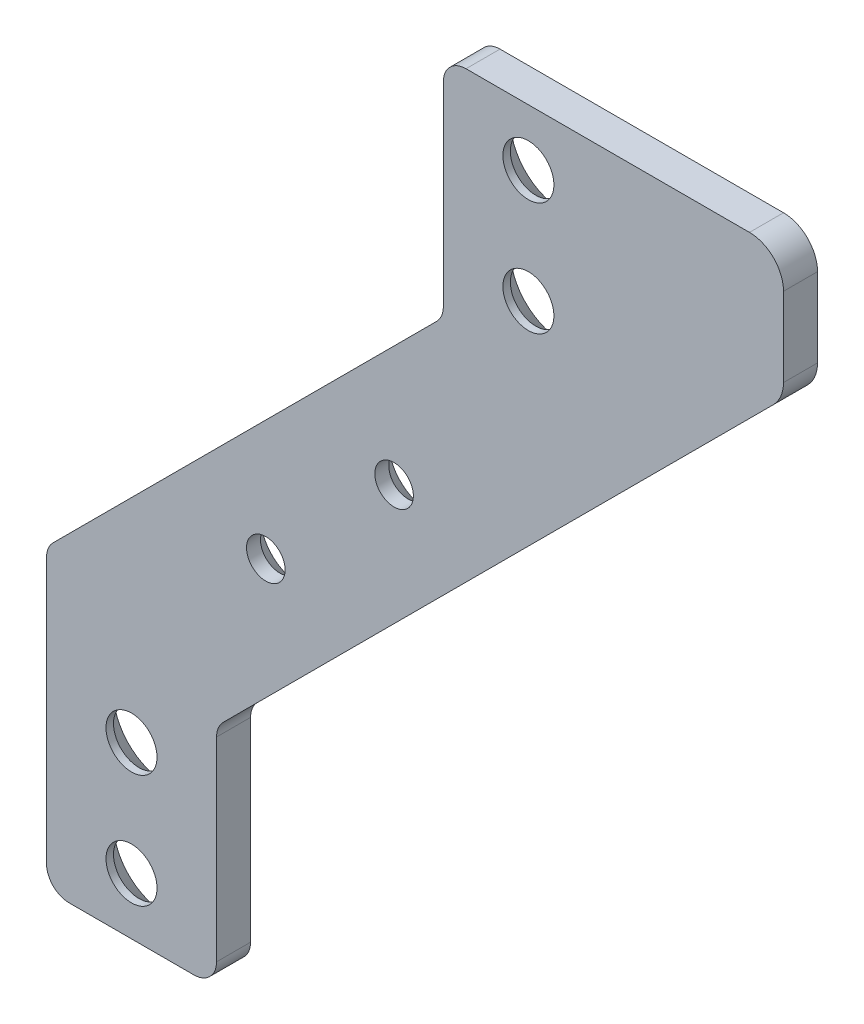
ISO-10303-21;
HEADER;
FILE_DESCRIPTION(('STEP AP214'),'2;1');
FILE_NAME('part.step','',(''),(''),'','','');
FILE_SCHEMA(('AUTOMOTIVE_DESIGN { 1 0 10303 214 1 1 1 1 }'));
ENDSEC;
DATA;
#1=APPLICATION_CONTEXT('core data for automotive mechanical design processes');
#2=APPLICATION_PROTOCOL_DEFINITION('international standard','automotive_design',2000,#1);
#3=PRODUCT_CONTEXT('',#1,'mechanical');
#4=PRODUCT('Part','Part','',(#3));
#5=PRODUCT_RELATED_PRODUCT_CATEGORY('part','',(#4));
#6=PRODUCT_DEFINITION_FORMATION('','',#4);
#7=PRODUCT_DEFINITION_CONTEXT('part definition',#1,'design');
#8=PRODUCT_DEFINITION('design','',#6,#7);
#9=PRODUCT_DEFINITION_SHAPE('','',#8);
#10=(LENGTH_UNIT() NAMED_UNIT(*) SI_UNIT(.MILLI.,.METRE.));
#11=(NAMED_UNIT(*) PLANE_ANGLE_UNIT() SI_UNIT($,.RADIAN.));
#12=(NAMED_UNIT(*) SI_UNIT($,.STERADIAN.) SOLID_ANGLE_UNIT());
#13=UNCERTAINTY_MEASURE_WITH_UNIT(LENGTH_MEASURE(1.E-05),#10,'distance_accuracy_value','');
#14=(GEOMETRIC_REPRESENTATION_CONTEXT(3) GLOBAL_UNCERTAINTY_ASSIGNED_CONTEXT((#13)) GLOBAL_UNIT_ASSIGNED_CONTEXT((#10,
#11,#12)) REPRESENTATION_CONTEXT('',''));
#15=CARTESIAN_POINT('',(0.,0.,0.));
#16=DIRECTION('',(0.,0.,1.));
#17=DIRECTION('',(1.,0.,0.));
#18=AXIS2_PLACEMENT_3D('',#15,#16,#17);
#19=CARTESIAN_POINT('',(0.,20.,3.));
#20=DIRECTION('',(-1.,0.,0.));
#21=DIRECTION('',(0.,-1.,0.));
#22=AXIS2_PLACEMENT_3D('',#19,#20,#21);
#23=PLANE('',#22);
#24=DIRECTION('',(0.,1.,0.));
#25=VECTOR('',#24,1.);
#26=CARTESIAN_POINT('',(0.,20.,3.));
#27=LINE('',#26,#25);
#28=CARTESIAN_POINT('',(0.,2.,3.));
#29=VERTEX_POINT('',#28);
#30=CARTESIAN_POINT('',(0.,19.1715728752538,3.));
#31=VERTEX_POINT('',#30);
#32=EDGE_CURVE('E170',#29,#31,#27,.T.);
#33=ORIENTED_EDGE('',*,*,#32,.F.);
#34=DIRECTION('',(0.,0.,-1.));
#35=VECTOR('',#34,1.);
#36=CARTESIAN_POINT('',(0.,2.,3.));
#37=LINE('',#36,#35);
#38=CARTESIAN_POINT('',(0.,2.,0.));
#39=VERTEX_POINT('',#38);
#40=EDGE_CURVE('E155',#29,#39,#37,.T.);
#41=ORIENTED_EDGE('',*,*,#40,.T.);
#42=DIRECTION('',(0.,1.,0.));
#43=VECTOR('',#42,1.);
#44=CARTESIAN_POINT('',(0.,20.,0.));
#45=LINE('',#44,#43);
#46=CARTESIAN_POINT('',(0.,19.1715728752538,0.));
#47=VERTEX_POINT('',#46);
#48=EDGE_CURVE('E167',#39,#47,#45,.T.);
#49=ORIENTED_EDGE('',*,*,#48,.T.);
#50=DIRECTION('',(0.,0.,-1.));
#51=VECTOR('',#50,1.);
#52=CARTESIAN_POINT('',(0.,19.1715728752538,3.));
#53=LINE('',#52,#51);
#54=EDGE_CURVE('E172',#47,#31,#53,.F.);
#55=ORIENTED_EDGE('',*,*,#54,.T.);
#56=EDGE_LOOP('',(#33,#41,#49,#55));
#57=FACE_BOUND('',#56,.T.);
#58=ADVANCED_FACE('F35',(#57),#23,.F.);
#59=CARTESIAN_POINT('',(35.,54.9999999999992,3.));
#60=DIRECTION('',(-0.70710678118654,0.707106781186555,0.));
#61=DIRECTION('',(-0.707106781186555,-0.70710678118654,0.));
#62=AXIS2_PLACEMENT_3D('',#59,#60,#61);
#63=PLANE('',#62);
#64=DIRECTION('',(0.707106781186555,0.70710678118654,0.));
#65=VECTOR('',#64,1.);
#66=CARTESIAN_POINT('',(35.,54.9999999999992,0.));
#67=LINE('',#66,#65);
#68=CARTESIAN_POINT('',(0.585786437626919,20.5857864376269,0.));
#69=VERTEX_POINT('',#68);
#70=CARTESIAN_POINT('',(49.1213203435596,69.1213203435585,0.));
#71=VERTEX_POINT('',#70);
#72=EDGE_CURVE('E179',#69,#71,#67,.T.);
#73=ORIENTED_EDGE('',*,*,#72,.T.);
#74=DIRECTION('',(0.,0.,-1.));
#75=VECTOR('',#74,1.);
#76=CARTESIAN_POINT('',(49.1213203435596,69.1213203435585,3.));
#77=LINE('',#76,#75);
#78=CARTESIAN_POINT('',(49.1213203435596,69.1213203435585,3.));
#79=VERTEX_POINT('',#78);
#80=EDGE_CURVE('E58',#71,#79,#77,.F.);
#81=ORIENTED_EDGE('',*,*,#80,.T.);
#82=DIRECTION('',(0.707106781186555,0.70710678118654,0.));
#83=VECTOR('',#82,1.);
#84=CARTESIAN_POINT('',(35.,54.9999999999992,3.));
#85=LINE('',#84,#83);
#86=CARTESIAN_POINT('',(0.585786437626919,20.5857864376269,3.));
#87=VERTEX_POINT('',#86);
#88=EDGE_CURVE('E287',#87,#79,#85,.T.);
#89=ORIENTED_EDGE('',*,*,#88,.F.);
#90=DIRECTION('',(0.,0.,-1.));
#91=VECTOR('',#90,1.);
#92=CARTESIAN_POINT('',(0.585786437626921,20.5857864376269,0.));
#93=LINE('',#92,#91);
#94=EDGE_CURVE('E238',#87,#69,#93,.T.);
#95=ORIENTED_EDGE('',*,*,#94,.T.);
#96=EDGE_LOOP('',(#73,#81,#89,#95));
#97=FACE_BOUND('',#96,.T.);
#98=ADVANCED_FACE('F298',(#97),#63,.F.);
#99=CARTESIAN_POINT('',(20.,81.2132034355957,3.));
#100=DIRECTION('',(0.,-1.,0.));
#101=DIRECTION('',(0.,0.,-1.));
#102=AXIS2_PLACEMENT_3D('',#99,#100,#101);
#103=PLANE('',#102);
#104=DIRECTION('',(-1.,0.,0.));
#105=VECTOR('',#104,1.);
#106=CARTESIAN_POINT('',(20.,81.2132034355957,3.));
#107=LINE('',#106,#105);
#108=CARTESIAN_POINT('',(47.,81.2132034355957,3.));
#109=VERTEX_POINT('',#108);
#110=CARTESIAN_POINT('',(22.,81.2132034355957,3.));
#111=VERTEX_POINT('',#110);
#112=EDGE_CURVE('E305',#109,#111,#107,.T.);
#113=ORIENTED_EDGE('',*,*,#112,.F.);
#114=DIRECTION('',(0.,0.,-1.));
#115=VECTOR('',#114,1.);
#116=CARTESIAN_POINT('',(47.,81.2132034355957,0.));
#117=LINE('',#116,#115);
#118=CARTESIAN_POINT('',(47.,81.2132034355957,0.));
#119=VERTEX_POINT('',#118);
#120=EDGE_CURVE('E11',#109,#119,#117,.T.);
#121=ORIENTED_EDGE('',*,*,#120,.T.);
#122=DIRECTION('',(-1.,0.,0.));
#123=VECTOR('',#122,1.);
#124=CARTESIAN_POINT('',(20.,81.2132034355957,0.));
#125=LINE('',#124,#123);
#126=CARTESIAN_POINT('',(22.,81.2132034355957,0.));
#127=VERTEX_POINT('',#126);
#128=EDGE_CURVE('E182',#119,#127,#125,.T.);
#129=ORIENTED_EDGE('',*,*,#128,.T.);
#130=DIRECTION('',(0.,0.,-1.));
#131=VECTOR('',#130,1.);
#132=CARTESIAN_POINT('',(22.,81.2132034355957,3.));
#133=LINE('',#132,#131);
#134=EDGE_CURVE('E235',#127,#111,#133,.F.);
#135=ORIENTED_EDGE('',*,*,#134,.T.);
#136=EDGE_LOOP('',(#113,#121,#129,#135));
#137=FACE_BOUND('',#136,.T.);
#138=ADVANCED_FACE('F355',(#137),#103,.F.);
#139=CARTESIAN_POINT('',(20.,61.2132034355957,3.));
#140=DIRECTION('',(1.,0.,0.));
#141=DIRECTION('',(0.,0.,-1.));
#142=AXIS2_PLACEMENT_3D('',#139,#140,#141);
#143=PLANE('',#142);
#144=DIRECTION('',(0.,-1.,0.));
#145=VECTOR('',#144,1.);
#146=CARTESIAN_POINT('',(20.,61.2132034355957,0.));
#147=LINE('',#146,#145);
#148=CARTESIAN_POINT('',(20.,79.2132034355957,0.));
#149=VERTEX_POINT('',#148);
#150=CARTESIAN_POINT('',(20.,62.0416305603419,0.));
#151=VERTEX_POINT('',#150);
#152=EDGE_CURVE('E192',#149,#151,#147,.T.);
#153=ORIENTED_EDGE('',*,*,#152,.T.);
#154=DIRECTION('',(0.,0.,-1.));
#155=VECTOR('',#154,1.);
#156=CARTESIAN_POINT('',(20.,62.0416305603419,3.));
#157=LINE('',#156,#155);
#158=CARTESIAN_POINT('',(20.,62.0416305603419,3.));
#159=VERTEX_POINT('',#158);
#160=EDGE_CURVE('E233',#151,#159,#157,.F.);
#161=ORIENTED_EDGE('',*,*,#160,.T.);
#162=DIRECTION('',(0.,-1.,0.));
#163=VECTOR('',#162,1.);
#164=CARTESIAN_POINT('',(20.,61.2132034355957,3.));
#165=LINE('',#164,#163);
#166=CARTESIAN_POINT('',(20.,79.2132034355957,3.));
#167=VERTEX_POINT('',#166);
#168=EDGE_CURVE('E311',#167,#159,#165,.T.);
#169=ORIENTED_EDGE('',*,*,#168,.F.);
#170=DIRECTION('',(0.,0.,-1.));
#171=VECTOR('',#170,1.);
#172=CARTESIAN_POINT('',(20.,79.2132034355957,3.));
#173=LINE('',#172,#171);
#174=EDGE_CURVE('E230',#167,#149,#173,.T.);
#175=ORIENTED_EDGE('',*,*,#174,.T.);
#176=EDGE_LOOP('',(#153,#161,#169,#175));
#177=FACE_BOUND('',#176,.T.);
#178=ADVANCED_FACE('F346',(#177),#143,.F.);
#179=CARTESIAN_POINT('',(-15.,26.2132034355958,3.));
#180=DIRECTION('',(0.707106781186546,-0.707106781186549,0.));
#181=DIRECTION('',(0.707106781186549,0.707106781186546,0.));
#182=AXIS2_PLACEMENT_3D('',#179,#180,#181);
#183=PLANE('',#182);
#184=DIRECTION('',(-0.707106781186549,-0.707106781186546,0.));
#185=VECTOR('',#184,1.);
#186=CARTESIAN_POINT('',(-15.,26.2132034355958,0.));
#187=LINE('',#186,#185);
#188=CARTESIAN_POINT('',(19.4142135623731,60.6274169979688,0.));
#189=VERTEX_POINT('',#188);
#190=CARTESIAN_POINT('',(-14.4142135623731,26.7989898732227,0.));
#191=VERTEX_POINT('',#190);
#192=EDGE_CURVE('E195',#189,#191,#187,.T.);
#193=ORIENTED_EDGE('',*,*,#192,.T.);
#194=DIRECTION('',(0.,0.,-1.));
#195=VECTOR('',#194,1.);
#196=CARTESIAN_POINT('',(-14.4142135623731,26.7989898732227,3.));
#197=LINE('',#196,#195);
#198=CARTESIAN_POINT('',(-14.4142135623731,26.7989898732227,3.));
#199=VERTEX_POINT('',#198);
#200=EDGE_CURVE('E228',#191,#199,#197,.F.);
#201=ORIENTED_EDGE('',*,*,#200,.T.);
#202=DIRECTION('',(-0.707106781186549,-0.707106781186546,0.));
#203=VECTOR('',#202,1.);
#204=CARTESIAN_POINT('',(-15.,26.2132034355958,3.));
#205=LINE('',#204,#203);
#206=CARTESIAN_POINT('',(19.4142135623731,60.6274169979688,3.));
#207=VERTEX_POINT('',#206);
#208=EDGE_CURVE('E314',#207,#199,#205,.T.);
#209=ORIENTED_EDGE('',*,*,#208,.F.);
#210=DIRECTION('',(0.,0.,-1.));
#211=VECTOR('',#210,1.);
#212=CARTESIAN_POINT('',(19.4142135623731,60.6274169979688,0.));
#213=LINE('',#212,#211);
#214=EDGE_CURVE('E225',#207,#189,#213,.T.);
#215=ORIENTED_EDGE('',*,*,#214,.T.);
#216=EDGE_LOOP('',(#193,#201,#209,#215));
#217=FACE_BOUND('',#216,.T.);
#218=ADVANCED_FACE('F337',(#217),#183,.F.);
#219=CARTESIAN_POINT('',(-15.,0.,3.));
#220=DIRECTION('',(1.,0.,0.));
#221=DIRECTION('',(0.,0.,-1.));
#222=AXIS2_PLACEMENT_3D('',#219,#220,#221);
#223=PLANE('',#222);
#224=DIRECTION('',(0.,-1.,0.));
#225=VECTOR('',#224,1.);
#226=CARTESIAN_POINT('',(-15.,0.,0.));
#227=LINE('',#226,#225);
#228=CARTESIAN_POINT('',(-15.,25.3847763108496,0.));
#229=VERTEX_POINT('',#228);
#230=CARTESIAN_POINT('',(-15.,2.,0.));
#231=VERTEX_POINT('',#230);
#232=EDGE_CURVE('E198',#229,#231,#227,.T.);
#233=ORIENTED_EDGE('',*,*,#232,.T.);
#234=DIRECTION('',(0.,0.,-1.));
#235=VECTOR('',#234,1.);
#236=CARTESIAN_POINT('',(-15.,2.,3.));
#237=LINE('',#236,#235);
#238=CARTESIAN_POINT('',(-15.,2.,3.));
#239=VERTEX_POINT('',#238);
#240=EDGE_CURVE('E223',#231,#239,#237,.F.);
#241=ORIENTED_EDGE('',*,*,#240,.T.);
#242=DIRECTION('',(0.,-1.,0.));
#243=VECTOR('',#242,1.);
#244=CARTESIAN_POINT('',(-15.,0.,3.));
#245=LINE('',#244,#243);
#246=CARTESIAN_POINT('',(-15.,25.3847763108496,3.));
#247=VERTEX_POINT('',#246);
#248=EDGE_CURVE('E316',#247,#239,#245,.T.);
#249=ORIENTED_EDGE('',*,*,#248,.F.);
#250=DIRECTION('',(0.,0.,-1.));
#251=VECTOR('',#250,1.);
#252=CARTESIAN_POINT('',(-15.,25.3847763108496,3.));
#253=LINE('',#252,#251);
#254=EDGE_CURVE('E220',#247,#229,#253,.T.);
#255=ORIENTED_EDGE('',*,*,#254,.T.);
#256=EDGE_LOOP('',(#233,#241,#249,#255));
#257=FACE_BOUND('',#256,.T.);
#258=ADVANCED_FACE('F329',(#257),#223,.F.);
#259=CARTESIAN_POINT('',(0.,0.,3.));
#260=DIRECTION('',(0.,1.,0.));
#261=DIRECTION('',(0.,0.,1.));
#262=AXIS2_PLACEMENT_3D('',#259,#260,#261);
#263=PLANE('',#262);
#264=DIRECTION('',(1.,0.,0.));
#265=VECTOR('',#264,1.);
#266=CARTESIAN_POINT('',(0.,0.,0.));
#267=LINE('',#266,#265);
#268=CARTESIAN_POINT('',(-13.,0.,0.));
#269=VERTEX_POINT('',#268);
#270=CARTESIAN_POINT('',(-2.,0.,0.));
#271=VERTEX_POINT('',#270);
#272=EDGE_CURVE('E201',#269,#271,#267,.T.);
#273=ORIENTED_EDGE('',*,*,#272,.T.);
#274=DIRECTION('',(0.,0.,-1.));
#275=VECTOR('',#274,1.);
#276=CARTESIAN_POINT('',(-2.,0.,3.));
#277=LINE('',#276,#275);
#278=CARTESIAN_POINT('',(-2.,0.,3.));
#279=VERTEX_POINT('',#278);
#280=EDGE_CURVE('E156',#271,#279,#277,.F.);
#281=ORIENTED_EDGE('',*,*,#280,.T.);
#282=DIRECTION('',(1.,0.,0.));
#283=VECTOR('',#282,1.);
#284=CARTESIAN_POINT('',(0.,0.,3.));
#285=LINE('',#284,#283);
#286=CARTESIAN_POINT('',(-13.,0.,3.));
#287=VERTEX_POINT('',#286);
#288=EDGE_CURVE('E188',#287,#279,#285,.T.);
#289=ORIENTED_EDGE('',*,*,#288,.F.);
#290=DIRECTION('',(0.,0.,-1.));
#291=VECTOR('',#290,1.);
#292=CARTESIAN_POINT('',(-13.,0.,3.));
#293=LINE('',#292,#291);
#294=EDGE_CURVE('E161',#287,#269,#293,.T.);
#295=ORIENTED_EDGE('',*,*,#294,.T.);
#296=EDGE_LOOP('',(#273,#281,#289,#295));
#297=FACE_BOUND('',#296,.T.);
#298=ADVANCED_FACE('F323',(#297),#263,.F.);
#299=CARTESIAN_POINT('',(0.,0.,3.));
#300=DIRECTION('',(0.,0.,-1.));
#301=DIRECTION('',(-1.,0.,0.));
#302=AXIS2_PLACEMENT_3D('',#299,#300,#301);
#303=PLANE('',#302);
#304=CARTESIAN_POINT('',(15.6568542494924,46.2634559672906,3.));
#305=DIRECTION('',(0.,0.,-1.));
#306=DIRECTION('',(-1.,0.,0.));
#307=AXIS2_PLACEMENT_3D('',#304,#305,#306);
#308=CIRCLE('',#307,1.69999999999999);
#309=CARTESIAN_POINT('',(13.9568542494924,46.2634559672906,3.));
#310=VERTEX_POINT('',#309);
#311=EDGE_CURVE('E269',#310,#310,#308,.T.);
#312=ORIENTED_EDGE('',*,*,#311,.T.);
#313=EDGE_LOOP('',(#312));
#314=FACE_BOUND('',#313,.T.);
#315=CARTESIAN_POINT('',(4.34314575050764,34.9497474683058,3.));
#316=DIRECTION('',(0.,0.,-1.));
#317=DIRECTION('',(-1.,0.,0.));
#318=AXIS2_PLACEMENT_3D('',#315,#316,#317);
#319=CIRCLE('',#318,1.69999999999999);
#320=CARTESIAN_POINT('',(2.64314575050765,34.9497474683058,3.));
#321=VERTEX_POINT('',#320);
#322=EDGE_CURVE('E264',#321,#321,#319,.T.);
#323=ORIENTED_EDGE('',*,*,#322,.T.);
#324=EDGE_LOOP('',(#323));
#325=FACE_BOUND('',#324,.T.);
#326=CARTESIAN_POINT('',(27.5,76.2132034355963,3.));
#327=DIRECTION('',(0.,0.,-1.));
#328=DIRECTION('',(-1.,0.,0.));
#329=AXIS2_PLACEMENT_3D('',#326,#327,#328);
#330=CIRCLE('',#329,2.24999999999999);
#331=CARTESIAN_POINT('',(25.25,76.2132034355963,3.));
#332=VERTEX_POINT('',#331);
#333=EDGE_CURVE('E259',#332,#332,#330,.T.);
#334=ORIENTED_EDGE('',*,*,#333,.T.);
#335=EDGE_LOOP('',(#334));
#336=FACE_BOUND('',#335,.T.);
#337=CARTESIAN_POINT('',(27.5,66.2132034355963,3.));
#338=DIRECTION('',(0.,0.,-1.));
#339=DIRECTION('',(-1.,0.,0.));
#340=AXIS2_PLACEMENT_3D('',#337,#338,#339);
#341=CIRCLE('',#340,2.24999999999999);
#342=CARTESIAN_POINT('',(25.25,66.2132034355963,3.));
#343=VERTEX_POINT('',#342);
#344=EDGE_CURVE('E254',#343,#343,#341,.T.);
#345=ORIENTED_EDGE('',*,*,#344,.T.);
#346=EDGE_LOOP('',(#345));
#347=FACE_BOUND('',#346,.T.);
#348=CARTESIAN_POINT('',(-7.5,15.,3.));
#349=DIRECTION('',(0.,0.,-1.));
#350=DIRECTION('',(-1.,0.,0.));
#351=AXIS2_PLACEMENT_3D('',#348,#349,#350);
#352=CIRCLE('',#351,2.24999999999999);
#353=CARTESIAN_POINT('',(-9.74999999999999,15.,3.));
#354=VERTEX_POINT('',#353);
#355=EDGE_CURVE('E249',#354,#354,#352,.T.);
#356=ORIENTED_EDGE('',*,*,#355,.T.);
#357=EDGE_LOOP('',(#356));
#358=FACE_BOUND('',#357,.T.);
#359=CARTESIAN_POINT('',(-7.5,5.,3.));
#360=DIRECTION('',(0.,0.,-1.));
#361=DIRECTION('',(-1.,0.,0.));
#362=AXIS2_PLACEMENT_3D('',#359,#360,#361);
#363=CIRCLE('',#362,2.24999999999999);
#364=CARTESIAN_POINT('',(-9.74999999999999,5.,3.));
#365=VERTEX_POINT('',#364);
#366=EDGE_CURVE('E180',#365,#365,#363,.T.);
#367=ORIENTED_EDGE('',*,*,#366,.T.);
#368=EDGE_LOOP('',(#367));
#369=FACE_BOUND('',#368,.T.);
#370=ORIENTED_EDGE('',*,*,#88,.T.);
#371=CARTESIAN_POINT('',(47.,71.2426406871182,3.));
#372=DIRECTION('',(0.,0.,-1.));
#373=DIRECTION('',(-1.,0.,0.));
#374=AXIS2_PLACEMENT_3D('',#371,#372,#373);
#375=CIRCLE('',#374,3.);
#376=CARTESIAN_POINT('',(50.,71.2426406871182,3.));
#377=VERTEX_POINT('',#376);
#378=EDGE_CURVE('E43',#79,#377,#375,.F.);
#379=ORIENTED_EDGE('',*,*,#378,.T.);
#380=DIRECTION('',(0.,1.,0.));
#381=VECTOR('',#380,1.);
#382=CARTESIAN_POINT('',(50.,81.2132034355963,3.));
#383=LINE('',#382,#381);
#384=CARTESIAN_POINT('',(50.,78.2132034355957,3.));
#385=VERTEX_POINT('',#384);
#386=EDGE_CURVE('E286',#377,#385,#383,.T.);
#387=ORIENTED_EDGE('',*,*,#386,.T.);
#388=CARTESIAN_POINT('',(47.,78.2132034355957,3.));
#389=DIRECTION('',(0.,0.,-1.));
#390=DIRECTION('',(-1.,0.,0.));
#391=AXIS2_PLACEMENT_3D('',#388,#389,#390);
#392=CIRCLE('',#391,3.);
#393=EDGE_CURVE('E50',#385,#109,#392,.F.);
#394=ORIENTED_EDGE('',*,*,#393,.T.);
#395=ORIENTED_EDGE('',*,*,#112,.T.);
#396=CARTESIAN_POINT('',(22.,79.2132034355957,3.));
#397=DIRECTION('',(0.,0.,-1.));
#398=DIRECTION('',(-1.,0.,0.));
#399=AXIS2_PLACEMENT_3D('',#396,#397,#398);
#400=CIRCLE('',#399,2.);
#401=EDGE_CURVE('E212',#111,#167,#400,.F.);
#402=ORIENTED_EDGE('',*,*,#401,.T.);
#403=ORIENTED_EDGE('',*,*,#168,.T.);
#404=CARTESIAN_POINT('',(18.,62.0416305603419,3.));
#405=DIRECTION('',(0.,0.,-1.));
#406=DIRECTION('',(-1.,0.,0.));
#407=AXIS2_PLACEMENT_3D('',#404,#405,#406);
#408=CIRCLE('',#407,2.);
#409=EDGE_CURVE('E243',#159,#207,#408,.T.);
#410=ORIENTED_EDGE('',*,*,#409,.T.);
#411=ORIENTED_EDGE('',*,*,#208,.T.);
#412=CARTESIAN_POINT('',(-13.,25.3847763108496,3.));
#413=DIRECTION('',(0.,0.,-1.));
#414=DIRECTION('',(-1.,0.,0.));
#415=AXIS2_PLACEMENT_3D('',#412,#413,#414);
#416=CIRCLE('',#415,2.);
#417=EDGE_CURVE('E214',#199,#247,#416,.F.);
#418=ORIENTED_EDGE('',*,*,#417,.T.);
#419=ORIENTED_EDGE('',*,*,#248,.T.);
#420=CARTESIAN_POINT('',(-13.,2.,3.));
#421=DIRECTION('',(0.,0.,-1.));
#422=DIRECTION('',(-1.,0.,0.));
#423=AXIS2_PLACEMENT_3D('',#420,#421,#422);
#424=CIRCLE('',#423,2.);
#425=EDGE_CURVE('E216',#239,#287,#424,.F.);
#426=ORIENTED_EDGE('',*,*,#425,.T.);
#427=ORIENTED_EDGE('',*,*,#288,.T.);
#428=CARTESIAN_POINT('',(-2.,2.,3.));
#429=DIRECTION('',(0.,0.,-1.));
#430=DIRECTION('',(-1.,0.,0.));
#431=AXIS2_PLACEMENT_3D('',#428,#429,#430);
#432=CIRCLE('',#431,2.);
#433=EDGE_CURVE('E218',#279,#29,#432,.F.);
#434=ORIENTED_EDGE('',*,*,#433,.T.);
#435=ORIENTED_EDGE('',*,*,#32,.T.);
#436=CARTESIAN_POINT('',(2.,19.1715728752538,3.));
#437=DIRECTION('',(0.,0.,-1.));
#438=DIRECTION('',(-1.,0.,0.));
#439=AXIS2_PLACEMENT_3D('',#436,#437,#438);
#440=CIRCLE('',#439,2.);
#441=EDGE_CURVE('E246',#31,#87,#440,.T.);
#442=ORIENTED_EDGE('',*,*,#441,.T.);
#443=EDGE_LOOP('',(#370,#379,#387,#394,#395,#402,#403,#410,#411,#418,#419,#426,#427,#434,#435,#442));
#444=FACE_BOUND('',#443,.T.);
#445=ADVANCED_FACE('F285',(#314,#325,#336,#347,#358,#369,#444),#303,.F.);
#446=CARTESIAN_POINT('',(0.,0.,0.));
#447=DIRECTION('',(0.,0.,-1.));
#448=DIRECTION('',(-1.,0.,0.));
#449=AXIS2_PLACEMENT_3D('',#446,#447,#448);
#450=PLANE('',#449);
#451=DIRECTION('',(0.,-1.,0.));
#452=VECTOR('',#451,1.);
#453=CARTESIAN_POINT('',(50.,81.2132034355963,0.));
#454=LINE('',#453,#452);
#455=CARTESIAN_POINT('',(50.,78.2132034355957,0.));
#456=VERTEX_POINT('',#455);
#457=CARTESIAN_POINT('',(50.,71.2426406871182,0.));
#458=VERTEX_POINT('',#457);
#459=EDGE_CURVE('E295',#456,#458,#454,.T.);
#460=ORIENTED_EDGE('',*,*,#459,.T.);
#461=CARTESIAN_POINT('',(47.,71.2426406871182,0.));
#462=DIRECTION('',(0.,0.,-1.));
#463=DIRECTION('',(-1.,0.,0.));
#464=AXIS2_PLACEMENT_3D('',#461,#462,#463);
#465=CIRCLE('',#464,3.);
#466=EDGE_CURVE('E280',#458,#71,#465,.T.);
#467=ORIENTED_EDGE('',*,*,#466,.T.);
#468=ORIENTED_EDGE('',*,*,#72,.F.);
#469=CARTESIAN_POINT('',(2.,19.1715728752538,0.));
#470=DIRECTION('',(0.,0.,-1.));
#471=DIRECTION('',(-1.,0.,0.));
#472=AXIS2_PLACEMENT_3D('',#469,#470,#471);
#473=CIRCLE('',#472,2.);
#474=EDGE_CURVE('E178',#69,#47,#473,.F.);
#475=ORIENTED_EDGE('',*,*,#474,.T.);
#476=ORIENTED_EDGE('',*,*,#48,.F.);
#477=CARTESIAN_POINT('',(-2.,2.,0.));
#478=DIRECTION('',(0.,0.,-1.));
#479=DIRECTION('',(-1.,0.,0.));
#480=AXIS2_PLACEMENT_3D('',#477,#478,#479);
#481=CIRCLE('',#480,2.);
#482=EDGE_CURVE('E151',#39,#271,#481,.T.);
#483=ORIENTED_EDGE('',*,*,#482,.T.);
#484=ORIENTED_EDGE('',*,*,#272,.F.);
#485=CARTESIAN_POINT('',(-13.,2.,0.));
#486=DIRECTION('',(0.,0.,-1.));
#487=DIRECTION('',(-1.,0.,0.));
#488=AXIS2_PLACEMENT_3D('',#485,#486,#487);
#489=CIRCLE('',#488,2.);
#490=EDGE_CURVE('E162',#269,#231,#489,.T.);
#491=ORIENTED_EDGE('',*,*,#490,.T.);
#492=ORIENTED_EDGE('',*,*,#232,.F.);
#493=CARTESIAN_POINT('',(-13.,25.3847763108496,0.));
#494=DIRECTION('',(0.,0.,-1.));
#495=DIRECTION('',(-1.,0.,0.));
#496=AXIS2_PLACEMENT_3D('',#493,#494,#495);
#497=CIRCLE('',#496,2.);
#498=EDGE_CURVE('E206',#229,#191,#497,.T.);
#499=ORIENTED_EDGE('',*,*,#498,.T.);
#500=ORIENTED_EDGE('',*,*,#192,.F.);
#501=CARTESIAN_POINT('',(18.,62.0416305603419,0.));
#502=DIRECTION('',(0.,0.,-1.));
#503=DIRECTION('',(-1.,0.,0.));
#504=AXIS2_PLACEMENT_3D('',#501,#502,#503);
#505=CIRCLE('',#504,2.);
#506=EDGE_CURVE('E241',#189,#151,#505,.F.);
#507=ORIENTED_EDGE('',*,*,#506,.T.);
#508=ORIENTED_EDGE('',*,*,#152,.F.);
#509=CARTESIAN_POINT('',(22.,79.2132034355957,0.));
#510=DIRECTION('',(0.,0.,-1.));
#511=DIRECTION('',(-1.,0.,0.));
#512=AXIS2_PLACEMENT_3D('',#509,#510,#511);
#513=CIRCLE('',#512,2.);
#514=EDGE_CURVE('E171',#149,#127,#513,.T.);
#515=ORIENTED_EDGE('',*,*,#514,.T.);
#516=ORIENTED_EDGE('',*,*,#128,.F.);
#517=CARTESIAN_POINT('',(47.,78.2132034355957,0.));
#518=DIRECTION('',(0.,0.,-1.));
#519=DIRECTION('',(-1.,0.,0.));
#520=AXIS2_PLACEMENT_3D('',#517,#518,#519);
#521=CIRCLE('',#520,3.);
#522=EDGE_CURVE('E278',#119,#456,#521,.T.);
#523=ORIENTED_EDGE('',*,*,#522,.T.);
#524=EDGE_LOOP('',(#460,#467,#468,#475,#476,#483,#484,#491,#492,#499,#500,#507,#508,#515,#516,#523));
#525=FACE_BOUND('',#524,.T.);
#526=CARTESIAN_POINT('',(15.6568542494924,46.2634559672906,0.));
#527=DIRECTION('',(0.,0.,-1.));
#528=DIRECTION('',(-1.,0.,0.));
#529=AXIS2_PLACEMENT_3D('',#526,#527,#528);
#530=CIRCLE('',#529,3.47);
#531=CARTESIAN_POINT('',(12.1868542494924,46.2634559672906,0.));
#532=VERTEX_POINT('',#531);
#533=EDGE_CURVE('E294',#532,#532,#530,.T.);
#534=ORIENTED_EDGE('',*,*,#533,.F.);
#535=EDGE_LOOP('',(#534));
#536=FACE_BOUND('',#535,.T.);
#537=CARTESIAN_POINT('',(4.34314575050764,34.9497474683058,0.));
#538=DIRECTION('',(0.,0.,-1.));
#539=DIRECTION('',(-1.,0.,0.));
#540=AXIS2_PLACEMENT_3D('',#537,#538,#539);
#541=CIRCLE('',#540,3.47);
#542=CARTESIAN_POINT('',(0.873145750507637,34.9497474683058,0.));
#543=VERTEX_POINT('',#542);
#544=EDGE_CURVE('E272',#543,#543,#541,.T.);
#545=ORIENTED_EDGE('',*,*,#544,.F.);
#546=EDGE_LOOP('',(#545));
#547=FACE_BOUND('',#546,.T.);
#548=CARTESIAN_POINT('',(27.5,76.2132034355963,0.));
#549=DIRECTION('',(0.,0.,-1.));
#550=DIRECTION('',(-1.,0.,0.));
#551=AXIS2_PLACEMENT_3D('',#548,#549,#550);
#552=CIRCLE('',#551,4.59);
#553=CARTESIAN_POINT('',(22.91,76.2132034355963,0.));
#554=VERTEX_POINT('',#553);
#555=EDGE_CURVE('E267',#554,#554,#552,.T.);
#556=ORIENTED_EDGE('',*,*,#555,.F.);
#557=EDGE_LOOP('',(#556));
#558=FACE_BOUND('',#557,.T.);
#559=CARTESIAN_POINT('',(27.5,66.2132034355963,0.));
#560=DIRECTION('',(0.,0.,-1.));
#561=DIRECTION('',(-1.,0.,0.));
#562=AXIS2_PLACEMENT_3D('',#559,#560,#561);
#563=CIRCLE('',#562,4.59);
#564=CARTESIAN_POINT('',(22.91,66.2132034355963,0.));
#565=VERTEX_POINT('',#564);
#566=EDGE_CURVE('E262',#565,#565,#563,.T.);
#567=ORIENTED_EDGE('',*,*,#566,.F.);
#568=EDGE_LOOP('',(#567));
#569=FACE_BOUND('',#568,.T.);
#570=CARTESIAN_POINT('',(-7.5,15.,0.));
#571=DIRECTION('',(0.,0.,-1.));
#572=DIRECTION('',(-1.,0.,0.));
#573=AXIS2_PLACEMENT_3D('',#570,#571,#572);
#574=CIRCLE('',#573,4.59);
#575=CARTESIAN_POINT('',(-12.09,15.,0.));
#576=VERTEX_POINT('',#575);
#577=EDGE_CURVE('E257',#576,#576,#574,.T.);
#578=ORIENTED_EDGE('',*,*,#577,.F.);
#579=EDGE_LOOP('',(#578));
#580=FACE_BOUND('',#579,.T.);
#581=CARTESIAN_POINT('',(-7.5,5.,0.));
#582=DIRECTION('',(0.,0.,-1.));
#583=DIRECTION('',(-1.,0.,0.));
#584=AXIS2_PLACEMENT_3D('',#581,#582,#583);
#585=CIRCLE('',#584,4.59);
#586=CARTESIAN_POINT('',(-12.09,5.,0.));
#587=VERTEX_POINT('',#586);
#588=EDGE_CURVE('E252',#587,#587,#585,.T.);
#589=ORIENTED_EDGE('',*,*,#588,.F.);
#590=EDGE_LOOP('',(#589));
#591=FACE_BOUND('',#590,.T.);
#592=ADVANCED_FACE('F175',(#525,#536,#547,#558,#569,#580,#591),#450,.T.);
#593=CARTESIAN_POINT('',(-2.,2.,3.));
#594=DIRECTION('',(0.,0.,-1.));
#595=DIRECTION('',(-1.,0.,0.));
#596=AXIS2_PLACEMENT_3D('',#593,#594,#595);
#597=CYLINDRICAL_SURFACE('',#596,2.);
#598=ORIENTED_EDGE('',*,*,#433,.F.);
#599=ORIENTED_EDGE('',*,*,#280,.F.);
#600=ORIENTED_EDGE('',*,*,#482,.F.);
#601=ORIENTED_EDGE('',*,*,#40,.F.);
#602=EDGE_LOOP('',(#598,#599,#600,#601));
#603=FACE_BOUND('',#602,.T.);
#604=ADVANCED_FACE('F154',(#603),#597,.T.);
#605=CARTESIAN_POINT('',(-13.,2.,3.));
#606=DIRECTION('',(0.,0.,-1.));
#607=DIRECTION('',(-1.,0.,0.));
#608=AXIS2_PLACEMENT_3D('',#605,#606,#607);
#609=CYLINDRICAL_SURFACE('',#608,2.);
#610=ORIENTED_EDGE('',*,*,#425,.F.);
#611=ORIENTED_EDGE('',*,*,#240,.F.);
#612=ORIENTED_EDGE('',*,*,#490,.F.);
#613=ORIENTED_EDGE('',*,*,#294,.F.);
#614=EDGE_LOOP('',(#610,#611,#612,#613));
#615=FACE_BOUND('',#614,.T.);
#616=ADVANCED_FACE('F325',(#615),#609,.T.);
#617=CARTESIAN_POINT('',(-13.,25.3847763108496,3.));
#618=DIRECTION('',(0.,0.,-1.));
#619=DIRECTION('',(-1.,0.,0.));
#620=AXIS2_PLACEMENT_3D('',#617,#618,#619);
#621=CYLINDRICAL_SURFACE('',#620,2.);
#622=ORIENTED_EDGE('',*,*,#417,.F.);
#623=ORIENTED_EDGE('',*,*,#200,.F.);
#624=ORIENTED_EDGE('',*,*,#498,.F.);
#625=ORIENTED_EDGE('',*,*,#254,.F.);
#626=EDGE_LOOP('',(#622,#623,#624,#625));
#627=FACE_BOUND('',#626,.T.);
#628=ADVANCED_FACE('F333',(#627),#621,.T.);
#629=CARTESIAN_POINT('',(18.,62.0416305603419,3.));
#630=DIRECTION('',(0.,0.,1.));
#631=DIRECTION('',(1.,0.,0.));
#632=AXIS2_PLACEMENT_3D('',#629,#630,#631);
#633=CYLINDRICAL_SURFACE('',#632,2.);
#634=ORIENTED_EDGE('',*,*,#409,.F.);
#635=ORIENTED_EDGE('',*,*,#160,.F.);
#636=ORIENTED_EDGE('',*,*,#506,.F.);
#637=ORIENTED_EDGE('',*,*,#214,.F.);
#638=EDGE_LOOP('',(#634,#635,#636,#637));
#639=FACE_BOUND('',#638,.T.);
#640=ADVANCED_FACE('F342',(#639),#633,.F.);
#641=CARTESIAN_POINT('',(22.,79.2132034355957,3.));
#642=DIRECTION('',(0.,0.,-1.));
#643=DIRECTION('',(-1.,0.,0.));
#644=AXIS2_PLACEMENT_3D('',#641,#642,#643);
#645=CYLINDRICAL_SURFACE('',#644,2.);
#646=ORIENTED_EDGE('',*,*,#401,.F.);
#647=ORIENTED_EDGE('',*,*,#134,.F.);
#648=ORIENTED_EDGE('',*,*,#514,.F.);
#649=ORIENTED_EDGE('',*,*,#174,.F.);
#650=EDGE_LOOP('',(#646,#647,#648,#649));
#651=FACE_BOUND('',#650,.T.);
#652=ADVANCED_FACE('F351',(#651),#645,.T.);
#653=CARTESIAN_POINT('',(2.,19.1715728752538,3.));
#654=DIRECTION('',(0.,0.,1.));
#655=DIRECTION('',(1.,0.,0.));
#656=AXIS2_PLACEMENT_3D('',#653,#654,#655);
#657=CYLINDRICAL_SURFACE('',#656,2.);
#658=ORIENTED_EDGE('',*,*,#441,.F.);
#659=ORIENTED_EDGE('',*,*,#54,.F.);
#660=ORIENTED_EDGE('',*,*,#474,.F.);
#661=ORIENTED_EDGE('',*,*,#94,.F.);
#662=EDGE_LOOP('',(#658,#659,#660,#661));
#663=FACE_BOUND('',#662,.T.);
#664=ADVANCED_FACE('F302',(#663),#657,.F.);
#665=CARTESIAN_POINT('',(-7.5,5.,0.));
#666=DIRECTION('',(0.,0.,-1.));
#667=DIRECTION('',(-1.,0.,0.));
#668=AXIS2_PLACEMENT_3D('',#665,#666,#667);
#669=CYLINDRICAL_SURFACE('',#668,2.24999999999999);
#670=CARTESIAN_POINT('',(-7.5,5.,2.34000000000001));
#671=DIRECTION('',(0.,0.,-1.));
#672=DIRECTION('',(-1.,0.,0.));
#673=AXIS2_PLACEMENT_3D('',#670,#671,#672);
#674=CIRCLE('',#673,2.24999999999999);
#675=CARTESIAN_POINT('',(-9.74999999999999,5.,2.34000000000001));
#676=VERTEX_POINT('',#675);
#677=EDGE_CURVE('E185',#676,#676,#674,.T.);
#678=ORIENTED_EDGE('',*,*,#677,.T.);
#679=EDGE_LOOP('',(#678));
#680=FACE_BOUND('',#679,.T.);
#681=ORIENTED_EDGE('',*,*,#366,.F.);
#682=EDGE_LOOP('',(#681));
#683=FACE_BOUND('',#682,.T.);
#684=ADVANCED_FACE('F381',(#680,#683),#669,.F.);
#685=CARTESIAN_POINT('',(-7.5,5.,0.));
#686=DIRECTION('',(0.,0.,-1.));
#687=DIRECTION('',(-1.,0.,0.));
#688=AXIS2_PLACEMENT_3D('',#685,#686,#687);
#689=CONICAL_SURFACE('',#688,4.59,0.785398163397448);
#690=ORIENTED_EDGE('',*,*,#677,.F.);
#691=EDGE_LOOP('',(#690));
#692=FACE_BOUND('',#691,.T.);
#693=ORIENTED_EDGE('',*,*,#588,.T.);
#694=EDGE_LOOP('',(#693));
#695=FACE_BOUND('',#694,.T.);
#696=ADVANCED_FACE('F385',(#692,#695),#689,.F.);
#697=CARTESIAN_POINT('',(-7.5,15.,0.));
#698=DIRECTION('',(0.,0.,-1.));
#699=DIRECTION('',(-1.,0.,0.));
#700=AXIS2_PLACEMENT_3D('',#697,#698,#699);
#701=CYLINDRICAL_SURFACE('',#700,2.24999999999999);
#702=CARTESIAN_POINT('',(-7.5,15.,2.34000000000001));
#703=DIRECTION('',(0.,0.,-1.));
#704=DIRECTION('',(-1.,0.,0.));
#705=AXIS2_PLACEMENT_3D('',#702,#703,#704);
#706=CIRCLE('',#705,2.24999999999999);
#707=CARTESIAN_POINT('',(-9.74999999999999,15.,2.34000000000001));
#708=VERTEX_POINT('',#707);
#709=EDGE_CURVE('E253',#708,#708,#706,.T.);
#710=ORIENTED_EDGE('',*,*,#709,.T.);
#711=EDGE_LOOP('',(#710));
#712=FACE_BOUND('',#711,.T.);
#713=ORIENTED_EDGE('',*,*,#355,.F.);
#714=EDGE_LOOP('',(#713));
#715=FACE_BOUND('',#714,.T.);
#716=ADVANCED_FACE('F391',(#712,#715),#701,.F.);
#717=CARTESIAN_POINT('',(-7.5,15.,0.));
#718=DIRECTION('',(0.,0.,-1.));
#719=DIRECTION('',(-1.,0.,0.));
#720=AXIS2_PLACEMENT_3D('',#717,#718,#719);
#721=CONICAL_SURFACE('',#720,4.59,0.785398163397448);
#722=ORIENTED_EDGE('',*,*,#709,.F.);
#723=EDGE_LOOP('',(#722));
#724=FACE_BOUND('',#723,.T.);
#725=ORIENTED_EDGE('',*,*,#577,.T.);
#726=EDGE_LOOP('',(#725));
#727=FACE_BOUND('',#726,.T.);
#728=ADVANCED_FACE('F483',(#724,#727),#721,.F.);
#729=CARTESIAN_POINT('',(27.5,66.2132034355963,0.));
#730=DIRECTION('',(0.,0.,-1.));
#731=DIRECTION('',(-1.,0.,0.));
#732=AXIS2_PLACEMENT_3D('',#729,#730,#731);
#733=CYLINDRICAL_SURFACE('',#732,2.24999999999999);
#734=CARTESIAN_POINT('',(27.5,66.2132034355963,2.34000000000001));
#735=DIRECTION('',(0.,0.,-1.));
#736=DIRECTION('',(-1.,0.,0.));
#737=AXIS2_PLACEMENT_3D('',#734,#735,#736);
#738=CIRCLE('',#737,2.24999999999999);
#739=CARTESIAN_POINT('',(25.25,66.2132034355963,2.34000000000001));
#740=VERTEX_POINT('',#739);
#741=EDGE_CURVE('E258',#740,#740,#738,.T.);
#742=ORIENTED_EDGE('',*,*,#741,.T.);
#743=EDGE_LOOP('',(#742));
#744=FACE_BOUND('',#743,.T.);
#745=ORIENTED_EDGE('',*,*,#344,.F.);
#746=EDGE_LOOP('',(#745));
#747=FACE_BOUND('',#746,.T.);
#748=ADVANCED_FACE('F492',(#744,#747),#733,.F.);
#749=CARTESIAN_POINT('',(27.5,66.2132034355963,0.));
#750=DIRECTION('',(0.,0.,-1.));
#751=DIRECTION('',(-1.,0.,0.));
#752=AXIS2_PLACEMENT_3D('',#749,#750,#751);
#753=CONICAL_SURFACE('',#752,4.59,0.785398163397448);
#754=ORIENTED_EDGE('',*,*,#741,.F.);
#755=EDGE_LOOP('',(#754));
#756=FACE_BOUND('',#755,.T.);
#757=ORIENTED_EDGE('',*,*,#566,.T.);
#758=EDGE_LOOP('',(#757));
#759=FACE_BOUND('',#758,.T.);
#760=ADVANCED_FACE('F502',(#756,#759),#753,.F.);
#761=CARTESIAN_POINT('',(27.5,76.2132034355963,0.));
#762=DIRECTION('',(0.,0.,-1.));
#763=DIRECTION('',(-1.,0.,0.));
#764=AXIS2_PLACEMENT_3D('',#761,#762,#763);
#765=CYLINDRICAL_SURFACE('',#764,2.24999999999999);
#766=CARTESIAN_POINT('',(27.5,76.2132034355963,2.34000000000001));
#767=DIRECTION('',(0.,0.,-1.));
#768=DIRECTION('',(-1.,0.,0.));
#769=AXIS2_PLACEMENT_3D('',#766,#767,#768);
#770=CIRCLE('',#769,2.24999999999999);
#771=CARTESIAN_POINT('',(25.25,76.2132034355963,2.34000000000001));
#772=VERTEX_POINT('',#771);
#773=EDGE_CURVE('E263',#772,#772,#770,.T.);
#774=ORIENTED_EDGE('',*,*,#773,.T.);
#775=EDGE_LOOP('',(#774));
#776=FACE_BOUND('',#775,.T.);
#777=ORIENTED_EDGE('',*,*,#333,.F.);
#778=EDGE_LOOP('',(#777));
#779=FACE_BOUND('',#778,.T.);
#780=ADVANCED_FACE('F512',(#776,#779),#765,.F.);
#781=CARTESIAN_POINT('',(27.5,76.2132034355963,0.));
#782=DIRECTION('',(0.,0.,-1.));
#783=DIRECTION('',(-1.,0.,0.));
#784=AXIS2_PLACEMENT_3D('',#781,#782,#783);
#785=CONICAL_SURFACE('',#784,4.59,0.785398163397449);
#786=ORIENTED_EDGE('',*,*,#773,.F.);
#787=EDGE_LOOP('',(#786));
#788=FACE_BOUND('',#787,.T.);
#789=ORIENTED_EDGE('',*,*,#555,.T.);
#790=EDGE_LOOP('',(#789));
#791=FACE_BOUND('',#790,.T.);
#792=ADVANCED_FACE('F522',(#788,#791),#785,.F.);
#793=CARTESIAN_POINT('',(4.34314575050764,34.9497474683058,0.));
#794=DIRECTION('',(0.,0.,-1.));
#795=DIRECTION('',(-1.,0.,0.));
#796=AXIS2_PLACEMENT_3D('',#793,#794,#795);
#797=CYLINDRICAL_SURFACE('',#796,1.69999999999999);
#798=CARTESIAN_POINT('',(4.34314575050764,34.9497474683058,1.77000000000001));
#799=DIRECTION('',(0.,0.,-1.));
#800=DIRECTION('',(-1.,0.,0.));
#801=AXIS2_PLACEMENT_3D('',#798,#799,#800);
#802=CIRCLE('',#801,1.69999999999999);
#803=CARTESIAN_POINT('',(2.64314575050765,34.9497474683058,1.77000000000001));
#804=VERTEX_POINT('',#803);
#805=EDGE_CURVE('E268',#804,#804,#802,.T.);
#806=ORIENTED_EDGE('',*,*,#805,.T.);
#807=EDGE_LOOP('',(#806));
#808=FACE_BOUND('',#807,.T.);
#809=ORIENTED_EDGE('',*,*,#322,.F.);
#810=EDGE_LOOP('',(#809));
#811=FACE_BOUND('',#810,.T.);
#812=ADVANCED_FACE('F532',(#808,#811),#797,.F.);
#813=CARTESIAN_POINT('',(4.34314575050764,34.9497474683058,0.));
#814=DIRECTION('',(0.,0.,-1.));
#815=DIRECTION('',(-1.,0.,0.));
#816=AXIS2_PLACEMENT_3D('',#813,#814,#815);
#817=CONICAL_SURFACE('',#816,3.47,0.785398163397449);
#818=ORIENTED_EDGE('',*,*,#805,.F.);
#819=EDGE_LOOP('',(#818));
#820=FACE_BOUND('',#819,.T.);
#821=ORIENTED_EDGE('',*,*,#544,.T.);
#822=EDGE_LOOP('',(#821));
#823=FACE_BOUND('',#822,.T.);
#824=ADVANCED_FACE('F542',(#820,#823),#817,.F.);
#825=CARTESIAN_POINT('',(15.6568542494924,46.2634559672906,0.));
#826=DIRECTION('',(0.,0.,-1.));
#827=DIRECTION('',(-1.,0.,0.));
#828=AXIS2_PLACEMENT_3D('',#825,#826,#827);
#829=CYLINDRICAL_SURFACE('',#828,1.69999999999999);
#830=CARTESIAN_POINT('',(15.6568542494924,46.2634559672906,1.77000000000001));
#831=DIRECTION('',(0.,0.,-1.));
#832=DIRECTION('',(-1.,0.,0.));
#833=AXIS2_PLACEMENT_3D('',#830,#831,#832);
#834=CIRCLE('',#833,1.69999999999999);
#835=CARTESIAN_POINT('',(13.9568542494924,46.2634559672906,1.77000000000001));
#836=VERTEX_POINT('',#835);
#837=EDGE_CURVE('E273',#836,#836,#834,.T.);
#838=ORIENTED_EDGE('',*,*,#837,.T.);
#839=EDGE_LOOP('',(#838));
#840=FACE_BOUND('',#839,.T.);
#841=ORIENTED_EDGE('',*,*,#311,.F.);
#842=EDGE_LOOP('',(#841));
#843=FACE_BOUND('',#842,.T.);
#844=ADVANCED_FACE('F552',(#840,#843),#829,.F.);
#845=CARTESIAN_POINT('',(15.6568542494924,46.2634559672906,0.));
#846=DIRECTION('',(0.,0.,-1.));
#847=DIRECTION('',(-1.,0.,0.));
#848=AXIS2_PLACEMENT_3D('',#845,#846,#847);
#849=CONICAL_SURFACE('',#848,3.47,0.785398163397449);
#850=ORIENTED_EDGE('',*,*,#837,.F.);
#851=EDGE_LOOP('',(#850));
#852=FACE_BOUND('',#851,.T.);
#853=ORIENTED_EDGE('',*,*,#533,.T.);
#854=EDGE_LOOP('',(#853));
#855=FACE_BOUND('',#854,.T.);
#856=ADVANCED_FACE('F562',(#852,#855),#849,.F.);
#857=CARTESIAN_POINT('',(50.,81.2132034355963,34.7361916150184));
#858=DIRECTION('',(1.,0.,0.));
#859=DIRECTION('',(0.,1.,0.));
#860=AXIS2_PLACEMENT_3D('',#857,#858,#859);
#861=PLANE('',#860);
#862=ORIENTED_EDGE('',*,*,#386,.F.);
#863=DIRECTION('',(0.,0.,-1.));
#864=VECTOR('',#863,1.);
#865=CARTESIAN_POINT('',(50.,71.2426406871182,0.));
#866=LINE('',#865,#864);
#867=EDGE_CURVE('E275',#377,#458,#866,.T.);
#868=ORIENTED_EDGE('',*,*,#867,.T.);
#869=ORIENTED_EDGE('',*,*,#459,.F.);
#870=DIRECTION('',(0.,0.,-1.));
#871=VECTOR('',#870,1.);
#872=CARTESIAN_POINT('',(50.,78.2132034355957,3.));
#873=LINE('',#872,#871);
#874=EDGE_CURVE('E247',#456,#385,#873,.F.);
#875=ORIENTED_EDGE('',*,*,#874,.T.);
#876=EDGE_LOOP('',(#862,#868,#869,#875));
#877=FACE_BOUND('',#876,.T.);
#878=ADVANCED_FACE('F291',(#877),#861,.T.);
#879=CARTESIAN_POINT('',(47.,71.2426406871182,34.7361916150184));
#880=DIRECTION('',(0.,0.,1.));
#881=DIRECTION('',(1.,0.,0.));
#882=AXIS2_PLACEMENT_3D('',#879,#880,#881);
#883=CYLINDRICAL_SURFACE('',#882,3.);
#884=ORIENTED_EDGE('',*,*,#378,.F.);
#885=ORIENTED_EDGE('',*,*,#80,.F.);
#886=ORIENTED_EDGE('',*,*,#466,.F.);
#887=ORIENTED_EDGE('',*,*,#867,.F.);
#888=EDGE_LOOP('',(#884,#885,#886,#887));
#889=FACE_BOUND('',#888,.T.);
#890=ADVANCED_FACE('F297',(#889),#883,.T.);
#891=CARTESIAN_POINT('',(47.,78.2132034355957,3.));
#892=DIRECTION('',(0.,0.,1.));
#893=DIRECTION('',(1.,0.,0.));
#894=AXIS2_PLACEMENT_3D('',#891,#892,#893);
#895=CYLINDRICAL_SURFACE('',#894,3.);
#896=ORIENTED_EDGE('',*,*,#393,.F.);
#897=ORIENTED_EDGE('',*,*,#874,.F.);
#898=ORIENTED_EDGE('',*,*,#522,.F.);
#899=ORIENTED_EDGE('',*,*,#120,.F.);
#900=EDGE_LOOP('',(#896,#897,#898,#899));
#901=FACE_BOUND('',#900,.T.);
#902=ADVANCED_FACE('F37',(#901),#895,.T.);
#903=CLOSED_SHELL('',(#58,#98,#138,#178,#218,#258,#298,#445,#592,#604,#616,#628,#640,#652,#664,
#684,#696,#716,#728,#748,#760,#780,#792,#812,#824,#844,#856,#878,#890,#902));
#904=MANIFOLD_SOLID_BREP('B2',#903);
#905=ADVANCED_BREP_SHAPE_REPRESENTATION('',(#18,#904),#14);
#906=SHAPE_DEFINITION_REPRESENTATION(#9,#905);
ENDSEC;
END-ISO-10303-21;
